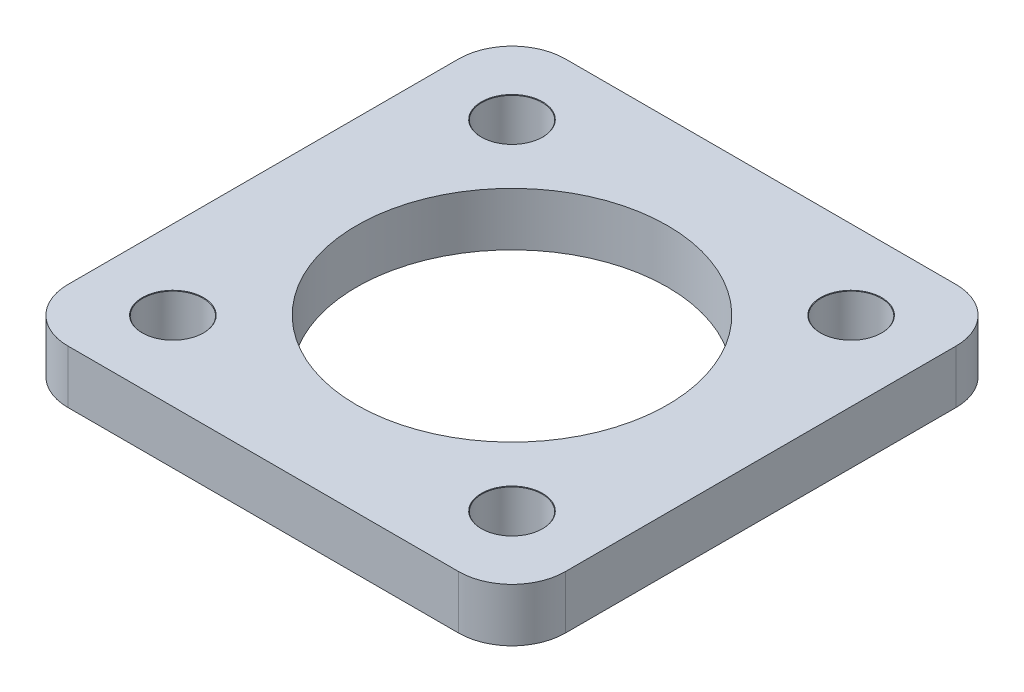
ISO-10303-21;
HEADER;
FILE_DESCRIPTION(('STEP AP214'),'2;1');
FILE_NAME('part.step','',(''),(''),'','','');
FILE_SCHEMA(('AUTOMOTIVE_DESIGN { 1 0 10303 214 1 1 1 1 }'));
ENDSEC;
DATA;
#1=APPLICATION_CONTEXT('core data for automotive mechanical design processes');
#2=APPLICATION_PROTOCOL_DEFINITION('international standard','automotive_design',2000,#1);
#3=PRODUCT_CONTEXT('',#1,'mechanical');
#4=PRODUCT('Part','Part','',(#3));
#5=PRODUCT_RELATED_PRODUCT_CATEGORY('part','',(#4));
#6=PRODUCT_DEFINITION_FORMATION('','',#4);
#7=PRODUCT_DEFINITION_CONTEXT('part definition',#1,'design');
#8=PRODUCT_DEFINITION('design','',#6,#7);
#9=PRODUCT_DEFINITION_SHAPE('','',#8);
#10=(LENGTH_UNIT() NAMED_UNIT(*) SI_UNIT(.MILLI.,.METRE.));
#11=(NAMED_UNIT(*) PLANE_ANGLE_UNIT() SI_UNIT($,.RADIAN.));
#12=(NAMED_UNIT(*) SI_UNIT($,.STERADIAN.) SOLID_ANGLE_UNIT());
#13=UNCERTAINTY_MEASURE_WITH_UNIT(LENGTH_MEASURE(1.E-05),#10,'distance_accuracy_value','');
#14=(GEOMETRIC_REPRESENTATION_CONTEXT(3) GLOBAL_UNCERTAINTY_ASSIGNED_CONTEXT((#13)) GLOBAL_UNIT_ASSIGNED_CONTEXT((#10,
#11,#12)) REPRESENTATION_CONTEXT('',''));
#15=CARTESIAN_POINT('',(0.,0.,0.));
#16=DIRECTION('',(0.,0.,1.));
#17=DIRECTION('',(1.,0.,0.));
#18=AXIS2_PLACEMENT_3D('',#15,#16,#17);
#19=CARTESIAN_POINT('',(0.,3.,0.));
#20=DIRECTION('',(0.,-1.,0.));
#21=DIRECTION('',(0.,0.,-1.));
#22=AXIS2_PLACEMENT_3D('',#19,#20,#21);
#23=PLANE('',#22);
#24=CARTESIAN_POINT('',(0.,3.,0.));
#25=DIRECTION('',(0.,1.,0.));
#26=DIRECTION('',(0.,0.,1.));
#27=AXIS2_PLACEMENT_3D('',#24,#25,#26);
#28=CIRCLE('',#27,8.75);
#29=CARTESIAN_POINT('',(0.,3.,8.75));
#30=VERTEX_POINT('',#29);
#31=EDGE_CURVE('E200',#30,#30,#28,.T.);
#32=ORIENTED_EDGE('',*,*,#31,.F.);
#33=EDGE_LOOP('',(#32));
#34=FACE_BOUND('',#33,.T.);
#35=DIRECTION('',(0.,0.,-1.));
#36=VECTOR('',#35,1.);
#37=CARTESIAN_POINT('',(14.,3.,-14.));
#38=LINE('',#37,#36);
#39=CARTESIAN_POINT('',(14.,3.,11.));
#40=VERTEX_POINT('',#39);
#41=CARTESIAN_POINT('',(14.,3.,-11.));
#42=VERTEX_POINT('',#41);
#43=EDGE_CURVE('E205',#40,#42,#38,.T.);
#44=ORIENTED_EDGE('',*,*,#43,.T.);
#45=CARTESIAN_POINT('',(11.,3.,-11.));
#46=DIRECTION('',(0.,-1.,0.));
#47=DIRECTION('',(0.,0.,-1.));
#48=AXIS2_PLACEMENT_3D('',#45,#46,#47);
#49=CIRCLE('',#48,3.);
#50=CARTESIAN_POINT('',(11.,3.,-14.));
#51=VERTEX_POINT('',#50);
#52=EDGE_CURVE('E174',#42,#51,#49,.F.);
#53=ORIENTED_EDGE('',*,*,#52,.T.);
#54=DIRECTION('',(-1.,0.,0.));
#55=VECTOR('',#54,1.);
#56=CARTESIAN_POINT('',(14.,3.,-14.));
#57=LINE('',#56,#55);
#58=CARTESIAN_POINT('',(-11.,3.,-14.));
#59=VERTEX_POINT('',#58);
#60=EDGE_CURVE('E133',#51,#59,#57,.T.);
#61=ORIENTED_EDGE('',*,*,#60,.T.);
#62=CARTESIAN_POINT('',(-11.,3.,-11.));
#63=DIRECTION('',(0.,-1.,0.));
#64=DIRECTION('',(0.,0.,-1.));
#65=AXIS2_PLACEMENT_3D('',#62,#63,#64);
#66=CIRCLE('',#65,3.);
#67=CARTESIAN_POINT('',(-14.,3.,-11.));
#68=VERTEX_POINT('',#67);
#69=EDGE_CURVE('E166',#59,#68,#66,.F.);
#70=ORIENTED_EDGE('',*,*,#69,.T.);
#71=DIRECTION('',(0.,0.,1.));
#72=VECTOR('',#71,1.);
#73=CARTESIAN_POINT('',(-14.,3.,-14.));
#74=LINE('',#73,#72);
#75=CARTESIAN_POINT('',(-14.,3.,11.));
#76=VERTEX_POINT('',#75);
#77=EDGE_CURVE('E141',#68,#76,#74,.T.);
#78=ORIENTED_EDGE('',*,*,#77,.T.);
#79=CARTESIAN_POINT('',(-11.,3.,11.));
#80=DIRECTION('',(0.,-1.,0.));
#81=DIRECTION('',(0.,0.,-1.));
#82=AXIS2_PLACEMENT_3D('',#79,#80,#81);
#83=CIRCLE('',#82,3.);
#84=CARTESIAN_POINT('',(-11.,3.,14.));
#85=VERTEX_POINT('',#84);
#86=EDGE_CURVE('E68',#76,#85,#83,.F.);
#87=ORIENTED_EDGE('',*,*,#86,.T.);
#88=DIRECTION('',(1.,0.,0.));
#89=VECTOR('',#88,1.);
#90=CARTESIAN_POINT('',(14.,3.,14.));
#91=LINE('',#90,#89);
#92=CARTESIAN_POINT('',(11.,3.,14.));
#93=VERTEX_POINT('',#92);
#94=EDGE_CURVE('E146',#85,#93,#91,.T.);
#95=ORIENTED_EDGE('',*,*,#94,.T.);
#96=CARTESIAN_POINT('',(11.,3.,11.));
#97=DIRECTION('',(0.,-1.,0.));
#98=DIRECTION('',(0.,0.,-1.));
#99=AXIS2_PLACEMENT_3D('',#96,#97,#98);
#100=CIRCLE('',#99,3.);
#101=EDGE_CURVE('E171',#93,#40,#100,.F.);
#102=ORIENTED_EDGE('',*,*,#101,.T.);
#103=EDGE_LOOP('',(#44,#53,#61,#70,#78,#87,#95,#102));
#104=FACE_BOUND('',#103,.T.);
#105=CARTESIAN_POINT('',(-9.54594154601834,3.,-9.54594154601791));
#106=DIRECTION('',(0.,1.,0.));
#107=DIRECTION('',(0.,0.,1.));
#108=AXIS2_PLACEMENT_3D('',#105,#106,#107);
#109=CIRCLE('',#108,1.725);
#110=CARTESIAN_POINT('',(-9.54594154601834,3.,-7.82094154601791));
#111=VERTEX_POINT('',#110);
#112=EDGE_CURVE('E222',#111,#111,#109,.T.);
#113=ORIENTED_EDGE('',*,*,#112,.F.);
#114=EDGE_LOOP('',(#113));
#115=FACE_BOUND('',#114,.T.);
#116=CARTESIAN_POINT('',(-9.54594154601791,3.,9.54594154601887));
#117=DIRECTION('',(0.,1.,0.));
#118=DIRECTION('',(0.,0.,1.));
#119=AXIS2_PLACEMENT_3D('',#116,#117,#118);
#120=CIRCLE('',#119,1.725);
#121=CARTESIAN_POINT('',(-9.54594154601791,3.,11.2709415460189));
#122=VERTEX_POINT('',#121);
#123=EDGE_CURVE('E234',#122,#122,#120,.T.);
#124=ORIENTED_EDGE('',*,*,#123,.F.);
#125=EDGE_LOOP('',(#124));
#126=FACE_BOUND('',#125,.T.);
#127=CARTESIAN_POINT('',(9.54594154601887,3.,9.54594154601844));
#128=DIRECTION('',(0.,1.,0.));
#129=DIRECTION('',(0.,0.,1.));
#130=AXIS2_PLACEMENT_3D('',#127,#128,#129);
#131=CIRCLE('',#130,1.725);
#132=CARTESIAN_POINT('',(9.54594154601887,3.,11.2709415460184));
#133=VERTEX_POINT('',#132);
#134=EDGE_CURVE('E246',#133,#133,#131,.T.);
#135=ORIENTED_EDGE('',*,*,#134,.F.);
#136=EDGE_LOOP('',(#135));
#137=FACE_BOUND('',#136,.T.);
#138=CARTESIAN_POINT('',(9.54594154601844,3.,-9.54594154601834));
#139=DIRECTION('',(0.,1.,0.));
#140=DIRECTION('',(0.,0.,1.));
#141=AXIS2_PLACEMENT_3D('',#138,#139,#140);
#142=CIRCLE('',#141,1.725);
#143=CARTESIAN_POINT('',(9.54594154601844,3.,-7.82094154601834));
#144=VERTEX_POINT('',#143);
#145=EDGE_CURVE('E258',#144,#144,#142,.T.);
#146=ORIENTED_EDGE('',*,*,#145,.F.);
#147=EDGE_LOOP('',(#146));
#148=FACE_BOUND('',#147,.T.);
#149=ADVANCED_FACE('F45',(#34,#104,#115,#126,#137,#148),#23,.F.);
#150=CARTESIAN_POINT('',(-14.,3.,-14.));
#151=DIRECTION('',(1.,0.,0.));
#152=DIRECTION('',(0.,0.,-1.));
#153=AXIS2_PLACEMENT_3D('',#150,#151,#152);
#154=PLANE('',#153);
#155=DIRECTION('',(0.,0.,1.));
#156=VECTOR('',#155,1.);
#157=CARTESIAN_POINT('',(-14.,0.,-14.));
#158=LINE('',#157,#156);
#159=CARTESIAN_POINT('',(-14.,0.,-11.));
#160=VERTEX_POINT('',#159);
#161=CARTESIAN_POINT('',(-14.,0.,11.));
#162=VERTEX_POINT('',#161);
#163=EDGE_CURVE('E189',#160,#162,#158,.T.);
#164=ORIENTED_EDGE('',*,*,#163,.T.);
#165=DIRECTION('',(0.,-1.,0.));
#166=VECTOR('',#165,1.);
#167=CARTESIAN_POINT('',(-14.,3.,11.));
#168=LINE('',#167,#166);
#169=EDGE_CURVE('E11',#162,#76,#168,.F.);
#170=ORIENTED_EDGE('',*,*,#169,.T.);
#171=ORIENTED_EDGE('',*,*,#77,.F.);
#172=DIRECTION('',(0.,-1.,0.));
#173=VECTOR('',#172,1.);
#174=CARTESIAN_POINT('',(-14.,3.,-11.));
#175=LINE('',#174,#173);
#176=EDGE_CURVE('E54',#68,#160,#175,.T.);
#177=ORIENTED_EDGE('',*,*,#176,.T.);
#178=EDGE_LOOP('',(#164,#170,#171,#177));
#179=FACE_BOUND('',#178,.T.);
#180=ADVANCED_FACE('F188',(#179),#154,.F.);
#181=CARTESIAN_POINT('',(14.,3.,14.));
#182=DIRECTION('',(0.,0.,-1.));
#183=DIRECTION('',(-1.,0.,0.));
#184=AXIS2_PLACEMENT_3D('',#181,#182,#183);
#185=PLANE('',#184);
#186=DIRECTION('',(1.,0.,0.));
#187=VECTOR('',#186,1.);
#188=CARTESIAN_POINT('',(14.,0.,14.));
#189=LINE('',#188,#187);
#190=CARTESIAN_POINT('',(-11.,0.,14.));
#191=VERTEX_POINT('',#190);
#192=CARTESIAN_POINT('',(11.,0.,14.));
#193=VERTEX_POINT('',#192);
#194=EDGE_CURVE('E148',#191,#193,#189,.T.);
#195=ORIENTED_EDGE('',*,*,#194,.T.);
#196=DIRECTION('',(0.,-1.,0.));
#197=VECTOR('',#196,1.);
#198=CARTESIAN_POINT('',(11.,3.,14.));
#199=LINE('',#198,#197);
#200=EDGE_CURVE('E61',#193,#93,#199,.F.);
#201=ORIENTED_EDGE('',*,*,#200,.T.);
#202=ORIENTED_EDGE('',*,*,#94,.F.);
#203=DIRECTION('',(0.,-1.,0.));
#204=VECTOR('',#203,1.);
#205=CARTESIAN_POINT('',(-11.,3.,14.));
#206=LINE('',#205,#204);
#207=EDGE_CURVE('E177',#85,#191,#206,.T.);
#208=ORIENTED_EDGE('',*,*,#207,.T.);
#209=EDGE_LOOP('',(#195,#201,#202,#208));
#210=FACE_BOUND('',#209,.T.);
#211=ADVANCED_FACE('F272',(#210),#185,.F.);
#212=CARTESIAN_POINT('',(14.,3.,-14.));
#213=DIRECTION('',(-1.,0.,0.));
#214=DIRECTION('',(0.,0.,1.));
#215=AXIS2_PLACEMENT_3D('',#212,#213,#214);
#216=PLANE('',#215);
#217=DIRECTION('',(0.,0.,-1.));
#218=VECTOR('',#217,1.);
#219=CARTESIAN_POINT('',(14.,0.,-14.));
#220=LINE('',#219,#218);
#221=CARTESIAN_POINT('',(14.,0.,11.));
#222=VERTEX_POINT('',#221);
#223=CARTESIAN_POINT('',(14.,0.,-11.));
#224=VERTEX_POINT('',#223);
#225=EDGE_CURVE('E142',#222,#224,#220,.T.);
#226=ORIENTED_EDGE('',*,*,#225,.T.);
#227=DIRECTION('',(0.,-1.,0.));
#228=VECTOR('',#227,1.);
#229=CARTESIAN_POINT('',(14.,3.,-11.));
#230=LINE('',#229,#228);
#231=EDGE_CURVE('E117',#224,#42,#230,.F.);
#232=ORIENTED_EDGE('',*,*,#231,.T.);
#233=ORIENTED_EDGE('',*,*,#43,.F.);
#234=DIRECTION('',(0.,-1.,0.));
#235=VECTOR('',#234,1.);
#236=CARTESIAN_POINT('',(14.,3.,11.));
#237=LINE('',#236,#235);
#238=EDGE_CURVE('E123',#40,#222,#237,.T.);
#239=ORIENTED_EDGE('',*,*,#238,.T.);
#240=EDGE_LOOP('',(#226,#232,#233,#239));
#241=FACE_BOUND('',#240,.T.);
#242=ADVANCED_FACE('F284',(#241),#216,.F.);
#243=CARTESIAN_POINT('',(14.,3.,-14.));
#244=DIRECTION('',(0.,0.,1.));
#245=DIRECTION('',(1.,0.,0.));
#246=AXIS2_PLACEMENT_3D('',#243,#244,#245);
#247=PLANE('',#246);
#248=ORIENTED_EDGE('',*,*,#60,.F.);
#249=DIRECTION('',(0.,-1.,0.));
#250=VECTOR('',#249,1.);
#251=CARTESIAN_POINT('',(11.,3.,-14.));
#252=LINE('',#251,#250);
#253=CARTESIAN_POINT('',(11.,0.,-14.));
#254=VERTEX_POINT('',#253);
#255=EDGE_CURVE('E116',#51,#254,#252,.T.);
#256=ORIENTED_EDGE('',*,*,#255,.T.);
#257=DIRECTION('',(-1.,0.,0.));
#258=VECTOR('',#257,1.);
#259=CARTESIAN_POINT('',(14.,0.,-14.));
#260=LINE('',#259,#258);
#261=CARTESIAN_POINT('',(-11.,0.,-14.));
#262=VERTEX_POINT('',#261);
#263=EDGE_CURVE('E130',#254,#262,#260,.T.);
#264=ORIENTED_EDGE('',*,*,#263,.T.);
#265=DIRECTION('',(0.,-1.,0.));
#266=VECTOR('',#265,1.);
#267=CARTESIAN_POINT('',(-11.,3.,-14.));
#268=LINE('',#267,#266);
#269=EDGE_CURVE('E136',#262,#59,#268,.F.);
#270=ORIENTED_EDGE('',*,*,#269,.T.);
#271=EDGE_LOOP('',(#248,#256,#264,#270));
#272=FACE_BOUND('',#271,.T.);
#273=ADVANCED_FACE('F129',(#272),#247,.F.);
#274=CARTESIAN_POINT('',(0.,0.,0.));
#275=DIRECTION('',(0.,-1.,0.));
#276=DIRECTION('',(0.,0.,-1.));
#277=AXIS2_PLACEMENT_3D('',#274,#275,#276);
#278=PLANE('',#277);
#279=CARTESIAN_POINT('',(9.54594154601844,0.,-9.54594154601834));
#280=DIRECTION('',(0.,-1.,0.));
#281=DIRECTION('',(0.,0.,-1.));
#282=AXIS2_PLACEMENT_3D('',#279,#280,#281);
#283=CIRCLE('',#282,1.7);
#284=CARTESIAN_POINT('',(9.54594154601844,0.,-11.2459415460183));
#285=VERTEX_POINT('',#284);
#286=EDGE_CURVE('E250',#285,#285,#283,.T.);
#287=ORIENTED_EDGE('',*,*,#286,.F.);
#288=EDGE_LOOP('',(#287));
#289=FACE_BOUND('',#288,.T.);
#290=CARTESIAN_POINT('',(9.54594154601887,0.,9.54594154601844));
#291=DIRECTION('',(0.,-1.,0.));
#292=DIRECTION('',(0.,0.,-1.));
#293=AXIS2_PLACEMENT_3D('',#290,#291,#292);
#294=CIRCLE('',#293,1.7);
#295=CARTESIAN_POINT('',(9.54594154601887,0.,7.84594154601844));
#296=VERTEX_POINT('',#295);
#297=EDGE_CURVE('E238',#296,#296,#294,.T.);
#298=ORIENTED_EDGE('',*,*,#297,.F.);
#299=EDGE_LOOP('',(#298));
#300=FACE_BOUND('',#299,.T.);
#301=CARTESIAN_POINT('',(-9.54594154601791,0.,9.54594154601887));
#302=DIRECTION('',(0.,-1.,0.));
#303=DIRECTION('',(0.,0.,-1.));
#304=AXIS2_PLACEMENT_3D('',#301,#302,#303);
#305=CIRCLE('',#304,1.7);
#306=CARTESIAN_POINT('',(-9.54594154601791,0.,7.84594154601887));
#307=VERTEX_POINT('',#306);
#308=EDGE_CURVE('E226',#307,#307,#305,.T.);
#309=ORIENTED_EDGE('',*,*,#308,.F.);
#310=EDGE_LOOP('',(#309));
#311=FACE_BOUND('',#310,.T.);
#312=CARTESIAN_POINT('',(-9.54594154601834,0.,-9.54594154601791));
#313=DIRECTION('',(0.,-1.,0.));
#314=DIRECTION('',(0.,0.,-1.));
#315=AXIS2_PLACEMENT_3D('',#312,#313,#314);
#316=CIRCLE('',#315,1.7);
#317=CARTESIAN_POINT('',(-9.54594154601834,0.,-11.2459415460179));
#318=VERTEX_POINT('',#317);
#319=EDGE_CURVE('E213',#318,#318,#316,.T.);
#320=ORIENTED_EDGE('',*,*,#319,.F.);
#321=EDGE_LOOP('',(#320));
#322=FACE_BOUND('',#321,.T.);
#323=CARTESIAN_POINT('',(0.,0.,0.));
#324=DIRECTION('',(0.,1.,0.));
#325=DIRECTION('',(0.,0.,1.));
#326=AXIS2_PLACEMENT_3D('',#323,#324,#325);
#327=CIRCLE('',#326,8.75);
#328=CARTESIAN_POINT('',(0.,0.,8.75));
#329=VERTEX_POINT('',#328);
#330=EDGE_CURVE('E195',#329,#329,#327,.T.);
#331=ORIENTED_EDGE('',*,*,#330,.T.);
#332=EDGE_LOOP('',(#331));
#333=FACE_BOUND('',#332,.T.);
#334=ORIENTED_EDGE('',*,*,#263,.F.);
#335=CARTESIAN_POINT('',(11.,0.,-11.));
#336=DIRECTION('',(0.,-1.,0.));
#337=DIRECTION('',(0.,0.,-1.));
#338=AXIS2_PLACEMENT_3D('',#335,#336,#337);
#339=CIRCLE('',#338,3.);
#340=EDGE_CURVE('E112',#254,#224,#339,.T.);
#341=ORIENTED_EDGE('',*,*,#340,.T.);
#342=ORIENTED_EDGE('',*,*,#225,.F.);
#343=CARTESIAN_POINT('',(11.,0.,11.));
#344=DIRECTION('',(0.,-1.,0.));
#345=DIRECTION('',(0.,0.,-1.));
#346=AXIS2_PLACEMENT_3D('',#343,#344,#345);
#347=CIRCLE('',#346,3.);
#348=EDGE_CURVE('E124',#222,#193,#347,.T.);
#349=ORIENTED_EDGE('',*,*,#348,.T.);
#350=ORIENTED_EDGE('',*,*,#194,.F.);
#351=CARTESIAN_POINT('',(-11.,0.,11.));
#352=DIRECTION('',(0.,-1.,0.));
#353=DIRECTION('',(0.,0.,-1.));
#354=AXIS2_PLACEMENT_3D('',#351,#352,#353);
#355=CIRCLE('',#354,3.);
#356=EDGE_CURVE('E156',#191,#162,#355,.T.);
#357=ORIENTED_EDGE('',*,*,#356,.T.);
#358=ORIENTED_EDGE('',*,*,#163,.F.);
#359=CARTESIAN_POINT('',(-11.,0.,-11.));
#360=DIRECTION('',(0.,-1.,0.));
#361=DIRECTION('',(0.,0.,-1.));
#362=AXIS2_PLACEMENT_3D('',#359,#360,#361);
#363=CIRCLE('',#362,3.);
#364=EDGE_CURVE('E135',#160,#262,#363,.T.);
#365=ORIENTED_EDGE('',*,*,#364,.T.);
#366=EDGE_LOOP('',(#334,#341,#342,#349,#350,#357,#358,#365));
#367=FACE_BOUND('',#366,.T.);
#368=ADVANCED_FACE('F138',(#289,#300,#311,#322,#333,#367),#278,.T.);
#369=CARTESIAN_POINT('',(0.,0.,0.));
#370=DIRECTION('',(0.,1.,0.));
#371=DIRECTION('',(0.,0.,1.));
#372=AXIS2_PLACEMENT_3D('',#369,#370,#371);
#373=CYLINDRICAL_SURFACE('',#372,8.75);
#374=ORIENTED_EDGE('',*,*,#330,.F.);
#375=EDGE_LOOP('',(#374));
#376=FACE_BOUND('',#375,.T.);
#377=ORIENTED_EDGE('',*,*,#31,.T.);
#378=EDGE_LOOP('',(#377));
#379=FACE_BOUND('',#378,.T.);
#380=ADVANCED_FACE('F277',(#376,#379),#373,.F.);
#381=CARTESIAN_POINT('',(-9.54594154601834,3.,-9.54594154601791));
#382=DIRECTION('',(0.,1.,0.));
#383=DIRECTION('',(0.,0.,1.));
#384=AXIS2_PLACEMENT_3D('',#381,#382,#383);
#385=CYLINDRICAL_SURFACE('',#384,1.7);
#386=CARTESIAN_POINT('',(-9.54594154601834,2.975,-9.54594154601791));
#387=DIRECTION('',(0.,1.,0.));
#388=DIRECTION('',(0.,0.,1.));
#389=AXIS2_PLACEMENT_3D('',#386,#387,#388);
#390=CIRCLE('',#389,1.7);
#391=CARTESIAN_POINT('',(-9.54594154601834,2.975,-7.84594154601791));
#392=VERTEX_POINT('',#391);
#393=EDGE_CURVE('E218',#392,#392,#390,.T.);
#394=ORIENTED_EDGE('',*,*,#393,.T.);
#395=EDGE_LOOP('',(#394));
#396=FACE_BOUND('',#395,.T.);
#397=ORIENTED_EDGE('',*,*,#319,.T.);
#398=EDGE_LOOP('',(#397));
#399=FACE_BOUND('',#398,.T.);
#400=ADVANCED_FACE('F339',(#396,#399),#385,.F.);
#401=CARTESIAN_POINT('',(-9.54594154601834,3.,-9.54594154601791));
#402=DIRECTION('',(0.,1.,0.));
#403=DIRECTION('',(0.,0.,1.));
#404=AXIS2_PLACEMENT_3D('',#401,#402,#403);
#405=CONICAL_SURFACE('',#404,1.725,0.785398163397483);
#406=ORIENTED_EDGE('',*,*,#393,.F.);
#407=EDGE_LOOP('',(#406));
#408=FACE_BOUND('',#407,.T.);
#409=ORIENTED_EDGE('',*,*,#112,.T.);
#410=EDGE_LOOP('',(#409));
#411=FACE_BOUND('',#410,.T.);
#412=ADVANCED_FACE('F336',(#408,#411),#405,.F.);
#413=CARTESIAN_POINT('',(-9.54594154601791,3.,9.54594154601887));
#414=DIRECTION('',(0.,1.,0.));
#415=DIRECTION('',(0.,0.,1.));
#416=AXIS2_PLACEMENT_3D('',#413,#414,#415);
#417=CYLINDRICAL_SURFACE('',#416,1.7);
#418=CARTESIAN_POINT('',(-9.54594154601791,2.975,9.54594154601887));
#419=DIRECTION('',(0.,1.,0.));
#420=DIRECTION('',(0.,0.,1.));
#421=AXIS2_PLACEMENT_3D('',#418,#419,#420);
#422=CIRCLE('',#421,1.7);
#423=CARTESIAN_POINT('',(-9.54594154601791,2.975,11.2459415460189));
#424=VERTEX_POINT('',#423);
#425=EDGE_CURVE('E230',#424,#424,#422,.T.);
#426=ORIENTED_EDGE('',*,*,#425,.T.);
#427=EDGE_LOOP('',(#426));
#428=FACE_BOUND('',#427,.T.);
#429=ORIENTED_EDGE('',*,*,#308,.T.);
#430=EDGE_LOOP('',(#429));
#431=FACE_BOUND('',#430,.T.);
#432=ADVANCED_FACE('F332',(#428,#431),#417,.F.);
#433=CARTESIAN_POINT('',(-9.54594154601791,3.,9.54594154601887));
#434=DIRECTION('',(0.,1.,0.));
#435=DIRECTION('',(0.,0.,1.));
#436=AXIS2_PLACEMENT_3D('',#433,#434,#435);
#437=CONICAL_SURFACE('',#436,1.725,0.785398163397483);
#438=ORIENTED_EDGE('',*,*,#425,.F.);
#439=EDGE_LOOP('',(#438));
#440=FACE_BOUND('',#439,.T.);
#441=ORIENTED_EDGE('',*,*,#123,.T.);
#442=EDGE_LOOP('',(#441));
#443=FACE_BOUND('',#442,.T.);
#444=ADVANCED_FACE('F324',(#440,#443),#437,.F.);
#445=CARTESIAN_POINT('',(9.54594154601887,3.,9.54594154601844));
#446=DIRECTION('',(0.,1.,0.));
#447=DIRECTION('',(0.,0.,1.));
#448=AXIS2_PLACEMENT_3D('',#445,#446,#447);
#449=CYLINDRICAL_SURFACE('',#448,1.7);
#450=CARTESIAN_POINT('',(9.54594154601887,2.975,9.54594154601844));
#451=DIRECTION('',(0.,1.,0.));
#452=DIRECTION('',(0.,0.,1.));
#453=AXIS2_PLACEMENT_3D('',#450,#451,#452);
#454=CIRCLE('',#453,1.7);
#455=CARTESIAN_POINT('',(9.54594154601887,2.975,11.2459415460184));
#456=VERTEX_POINT('',#455);
#457=EDGE_CURVE('E242',#456,#456,#454,.T.);
#458=ORIENTED_EDGE('',*,*,#457,.T.);
#459=EDGE_LOOP('',(#458));
#460=FACE_BOUND('',#459,.T.);
#461=ORIENTED_EDGE('',*,*,#297,.T.);
#462=EDGE_LOOP('',(#461));
#463=FACE_BOUND('',#462,.T.);
#464=ADVANCED_FACE('F315',(#460,#463),#449,.F.);
#465=CARTESIAN_POINT('',(9.54594154601887,3.,9.54594154601844));
#466=DIRECTION('',(0.,1.,0.));
#467=DIRECTION('',(0.,0.,1.));
#468=AXIS2_PLACEMENT_3D('',#465,#466,#467);
#469=CONICAL_SURFACE('',#468,1.725,0.785398163397483);
#470=ORIENTED_EDGE('',*,*,#457,.F.);
#471=EDGE_LOOP('',(#470));
#472=FACE_BOUND('',#471,.T.);
#473=ORIENTED_EDGE('',*,*,#134,.T.);
#474=EDGE_LOOP('',(#473));
#475=FACE_BOUND('',#474,.T.);
#476=ADVANCED_FACE('F312',(#472,#475),#469,.F.);
#477=CARTESIAN_POINT('',(9.54594154601844,3.,-9.54594154601834));
#478=DIRECTION('',(0.,1.,0.));
#479=DIRECTION('',(0.,0.,1.));
#480=AXIS2_PLACEMENT_3D('',#477,#478,#479);
#481=CYLINDRICAL_SURFACE('',#480,1.7);
#482=CARTESIAN_POINT('',(9.54594154601844,2.975,-9.54594154601834));
#483=DIRECTION('',(0.,1.,0.));
#484=DIRECTION('',(0.,0.,1.));
#485=AXIS2_PLACEMENT_3D('',#482,#483,#484);
#486=CIRCLE('',#485,1.7);
#487=CARTESIAN_POINT('',(9.54594154601844,2.975,-7.84594154601834));
#488=VERTEX_POINT('',#487);
#489=EDGE_CURVE('E254',#488,#488,#486,.T.);
#490=ORIENTED_EDGE('',*,*,#489,.T.);
#491=EDGE_LOOP('',(#490));
#492=FACE_BOUND('',#491,.T.);
#493=ORIENTED_EDGE('',*,*,#286,.T.);
#494=EDGE_LOOP('',(#493));
#495=FACE_BOUND('',#494,.T.);
#496=ADVANCED_FACE('F314',(#492,#495),#481,.F.);
#497=CARTESIAN_POINT('',(9.54594154601844,3.,-9.54594154601834));
#498=DIRECTION('',(0.,1.,0.));
#499=DIRECTION('',(0.,0.,1.));
#500=AXIS2_PLACEMENT_3D('',#497,#498,#499);
#501=CONICAL_SURFACE('',#500,1.725,0.785398163397483);
#502=ORIENTED_EDGE('',*,*,#489,.F.);
#503=EDGE_LOOP('',(#502));
#504=FACE_BOUND('',#503,.T.);
#505=ORIENTED_EDGE('',*,*,#145,.T.);
#506=EDGE_LOOP('',(#505));
#507=FACE_BOUND('',#506,.T.);
#508=ADVANCED_FACE('F263',(#504,#507),#501,.F.);
#509=CARTESIAN_POINT('',(11.,3.,-11.));
#510=DIRECTION('',(0.,-1.,0.));
#511=DIRECTION('',(0.,0.,-1.));
#512=AXIS2_PLACEMENT_3D('',#509,#510,#511);
#513=CYLINDRICAL_SURFACE('',#512,3.);
#514=ORIENTED_EDGE('',*,*,#52,.F.);
#515=ORIENTED_EDGE('',*,*,#231,.F.);
#516=ORIENTED_EDGE('',*,*,#340,.F.);
#517=ORIENTED_EDGE('',*,*,#255,.F.);
#518=EDGE_LOOP('',(#514,#515,#516,#517));
#519=FACE_BOUND('',#518,.T.);
#520=ADVANCED_FACE('F115',(#519),#513,.T.);
#521=CARTESIAN_POINT('',(11.,3.,11.));
#522=DIRECTION('',(0.,-1.,0.));
#523=DIRECTION('',(0.,0.,-1.));
#524=AXIS2_PLACEMENT_3D('',#521,#522,#523);
#525=CYLINDRICAL_SURFACE('',#524,3.);
#526=ORIENTED_EDGE('',*,*,#101,.F.);
#527=ORIENTED_EDGE('',*,*,#200,.F.);
#528=ORIENTED_EDGE('',*,*,#348,.F.);
#529=ORIENTED_EDGE('',*,*,#238,.F.);
#530=EDGE_LOOP('',(#526,#527,#528,#529));
#531=FACE_BOUND('',#530,.T.);
#532=ADVANCED_FACE('F292',(#531),#525,.T.);
#533=CARTESIAN_POINT('',(-11.,3.,11.));
#534=DIRECTION('',(0.,-1.,0.));
#535=DIRECTION('',(0.,0.,-1.));
#536=AXIS2_PLACEMENT_3D('',#533,#534,#535);
#537=CYLINDRICAL_SURFACE('',#536,3.);
#538=ORIENTED_EDGE('',*,*,#86,.F.);
#539=ORIENTED_EDGE('',*,*,#169,.F.);
#540=ORIENTED_EDGE('',*,*,#356,.F.);
#541=ORIENTED_EDGE('',*,*,#207,.F.);
#542=EDGE_LOOP('',(#538,#539,#540,#541));
#543=FACE_BOUND('',#542,.T.);
#544=ADVANCED_FACE('F294',(#543),#537,.T.);
#545=CARTESIAN_POINT('',(-11.,3.,-11.));
#546=DIRECTION('',(0.,-1.,0.));
#547=DIRECTION('',(0.,0.,-1.));
#548=AXIS2_PLACEMENT_3D('',#545,#546,#547);
#549=CYLINDRICAL_SURFACE('',#548,3.);
#550=ORIENTED_EDGE('',*,*,#69,.F.);
#551=ORIENTED_EDGE('',*,*,#269,.F.);
#552=ORIENTED_EDGE('',*,*,#364,.F.);
#553=ORIENTED_EDGE('',*,*,#176,.F.);
#554=EDGE_LOOP('',(#550,#551,#552,#553));
#555=FACE_BOUND('',#554,.T.);
#556=ADVANCED_FACE('F47',(#555),#549,.T.);
#557=CLOSED_SHELL('',(#149,#180,#211,#242,#273,#368,#380,#400,#412,#432,#444,#464,#476,#496,
#508,#520,#532,#544,#556));
#558=MANIFOLD_SOLID_BREP('B2',#557);
#559=ADVANCED_BREP_SHAPE_REPRESENTATION('',(#18,#558),#14);
#560=SHAPE_DEFINITION_REPRESENTATION(#9,#559);
ENDSEC;
END-ISO-10303-21;
